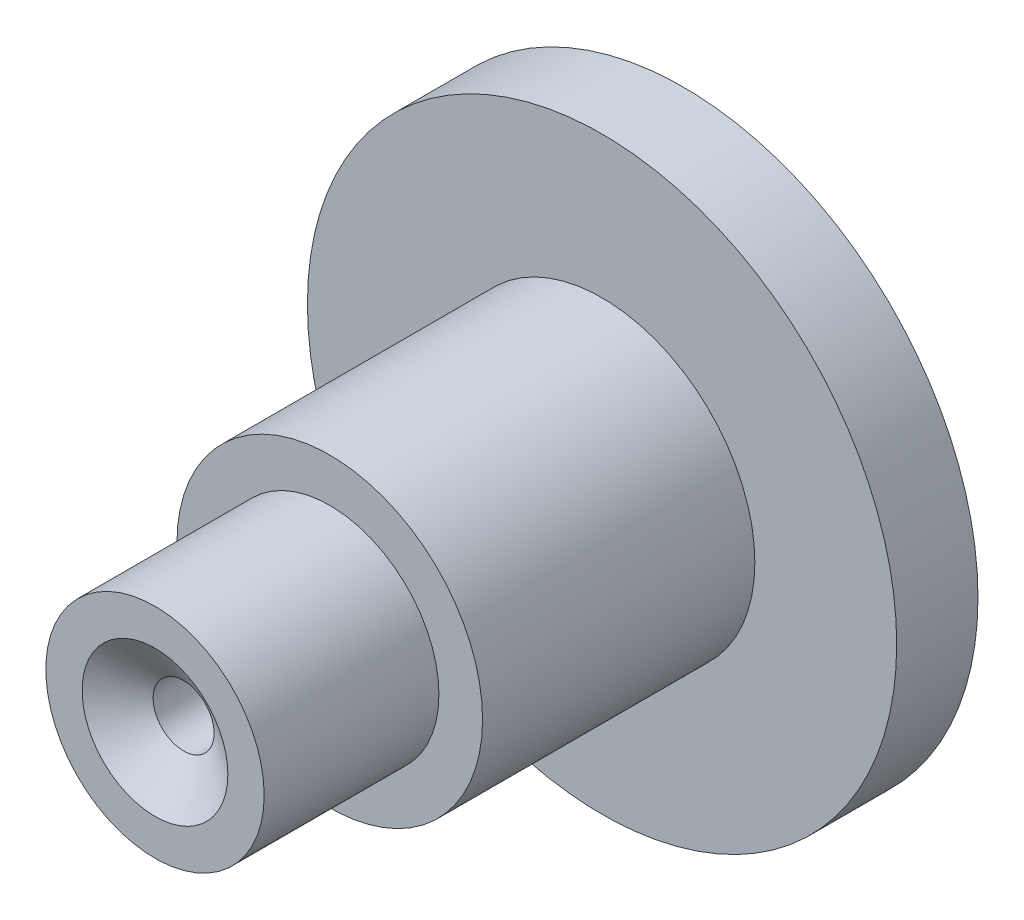
ISO-10303-21;
HEADER;
FILE_DESCRIPTION(('STEP AP214'),'2;1');
FILE_NAME('part.step','',(''),(''),'','','');
FILE_SCHEMA(('AUTOMOTIVE_DESIGN { 1 0 10303 214 1 1 1 1 }'));
ENDSEC;
DATA;
#1=APPLICATION_CONTEXT('core data for automotive mechanical design processes');
#2=APPLICATION_PROTOCOL_DEFINITION('international standard','automotive_design',2000,#1);
#3=PRODUCT_CONTEXT('',#1,'mechanical');
#4=PRODUCT('Part','Part','',(#3));
#5=PRODUCT_RELATED_PRODUCT_CATEGORY('part','',(#4));
#6=PRODUCT_DEFINITION_FORMATION('','',#4);
#7=PRODUCT_DEFINITION_CONTEXT('part definition',#1,'design');
#8=PRODUCT_DEFINITION('design','',#6,#7);
#9=PRODUCT_DEFINITION_SHAPE('','',#8);
#10=(LENGTH_UNIT() NAMED_UNIT(*) SI_UNIT(.MILLI.,.METRE.));
#11=(NAMED_UNIT(*) PLANE_ANGLE_UNIT() SI_UNIT($,.RADIAN.));
#12=(NAMED_UNIT(*) SI_UNIT($,.STERADIAN.) SOLID_ANGLE_UNIT());
#13=UNCERTAINTY_MEASURE_WITH_UNIT(LENGTH_MEASURE(1.E-05),#10,'distance_accuracy_value','');
#14=(GEOMETRIC_REPRESENTATION_CONTEXT(3) GLOBAL_UNCERTAINTY_ASSIGNED_CONTEXT((#13)) GLOBAL_UNIT_ASSIGNED_CONTEXT((#10,
#11,#12)) REPRESENTATION_CONTEXT('',''));
#15=CARTESIAN_POINT('',(0.,0.,0.));
#16=DIRECTION('',(0.,0.,1.));
#17=DIRECTION('',(1.,0.,0.));
#18=AXIS2_PLACEMENT_3D('',#15,#16,#17);
#19=CARTESIAN_POINT('',(0.,0.,0.));
#20=DIRECTION('',(0.,0.,1.));
#21=DIRECTION('',(1.,0.,0.));
#22=AXIS2_PLACEMENT_3D('',#19,#20,#21);
#23=PLANE('',#22);
#24=CARTESIAN_POINT('',(0.,0.,0.));
#25=DIRECTION('',(0.,0.,1.));
#26=DIRECTION('',(1.,0.,0.));
#27=AXIS2_PLACEMENT_3D('',#24,#25,#26);
#28=CIRCLE('',#27,46.0375);
#29=CARTESIAN_POINT('',(46.0375,0.,0.));
#30=VERTEX_POINT('',#29);
#31=EDGE_CURVE('E10',#30,#30,#28,.T.);
#32=ORIENTED_EDGE('',*,*,#31,.F.);
#33=EDGE_LOOP('',(#32));
#34=FACE_BOUND('',#33,.T.);
#35=ADVANCED_FACE('F37',(#34),#23,.F.);
#36=CARTESIAN_POINT('',(0.,0.,57.15));
#37=DIRECTION('',(0.,0.,1.));
#38=DIRECTION('',(1.,0.,0.));
#39=AXIS2_PLACEMENT_3D('',#36,#37,#38);
#40=CYLINDRICAL_SURFACE('',#39,46.0375);
#41=CARTESIAN_POINT('',(0.,0.,12.7));
#42=DIRECTION('',(0.,0.,1.));
#43=DIRECTION('',(1.,0.,0.));
#44=AXIS2_PLACEMENT_3D('',#41,#42,#43);
#45=CIRCLE('',#44,46.0375);
#46=CARTESIAN_POINT('',(46.0375,0.,12.7));
#47=VERTEX_POINT('',#46);
#48=EDGE_CURVE('E44',#47,#47,#45,.T.);
#49=ORIENTED_EDGE('',*,*,#48,.F.);
#50=EDGE_LOOP('',(#49));
#51=FACE_BOUND('',#50,.T.);
#52=ORIENTED_EDGE('',*,*,#31,.T.);
#53=EDGE_LOOP('',(#52));
#54=FACE_BOUND('',#53,.T.);
#55=ADVANCED_FACE('F121',(#51,#54),#40,.T.);
#56=CARTESIAN_POINT('',(0.,46.0375,12.7));
#57=DIRECTION('',(0.,0.,-1.));
#58=DIRECTION('',(-1.,0.,0.));
#59=AXIS2_PLACEMENT_3D('',#56,#57,#58);
#60=PLANE('',#59);
#61=CARTESIAN_POINT('',(0.,0.,12.7));
#62=DIRECTION('',(0.,0.,1.));
#63=DIRECTION('',(1.,0.,0.));
#64=AXIS2_PLACEMENT_3D('',#61,#62,#63);
#65=CIRCLE('',#64,23.876);
#66=CARTESIAN_POINT('',(23.876,0.,12.7));
#67=VERTEX_POINT('',#66);
#68=EDGE_CURVE('E49',#67,#67,#65,.T.);
#69=ORIENTED_EDGE('',*,*,#68,.F.);
#70=EDGE_LOOP('',(#69));
#71=FACE_BOUND('',#70,.T.);
#72=ORIENTED_EDGE('',*,*,#48,.T.);
#73=EDGE_LOOP('',(#72));
#74=FACE_BOUND('',#73,.T.);
#75=ADVANCED_FACE('F116',(#71,#74),#60,.F.);
#76=CARTESIAN_POINT('',(0.,0.,57.15));
#77=DIRECTION('',(0.,0.,1.));
#78=DIRECTION('',(1.,0.,0.));
#79=AXIS2_PLACEMENT_3D('',#76,#77,#78);
#80=CYLINDRICAL_SURFACE('',#79,23.876);
#81=CARTESIAN_POINT('',(0.,0.,55.245));
#82=DIRECTION('',(0.,0.,1.));
#83=DIRECTION('',(1.,0.,0.));
#84=AXIS2_PLACEMENT_3D('',#81,#82,#83);
#85=CIRCLE('',#84,23.876);
#86=CARTESIAN_POINT('',(23.876,0.,55.245));
#87=VERTEX_POINT('',#86);
#88=EDGE_CURVE('E54',#87,#87,#85,.T.);
#89=ORIENTED_EDGE('',*,*,#88,.F.);
#90=EDGE_LOOP('',(#89));
#91=FACE_BOUND('',#90,.T.);
#92=ORIENTED_EDGE('',*,*,#68,.T.);
#93=EDGE_LOOP('',(#92));
#94=FACE_BOUND('',#93,.T.);
#95=ADVANCED_FACE('F110',(#91,#94),#80,.T.);
#96=CARTESIAN_POINT('',(0.,23.876,55.245));
#97=DIRECTION('',(0.,0.,-1.));
#98=DIRECTION('',(-1.,0.,0.));
#99=AXIS2_PLACEMENT_3D('',#96,#97,#98);
#100=PLANE('',#99);
#101=CARTESIAN_POINT('',(0.,0.,55.245));
#102=DIRECTION('',(0.,0.,1.));
#103=DIRECTION('',(1.,0.,0.));
#104=AXIS2_PLACEMENT_3D('',#101,#102,#103);
#105=CIRCLE('',#104,17.0595499569898);
#106=CARTESIAN_POINT('',(17.0595499569898,0.,55.245));
#107=VERTEX_POINT('',#106);
#108=EDGE_CURVE('E60',#107,#107,#105,.T.);
#109=ORIENTED_EDGE('',*,*,#108,.F.);
#110=EDGE_LOOP('',(#109));
#111=FACE_BOUND('',#110,.T.);
#112=ORIENTED_EDGE('',*,*,#88,.T.);
#113=EDGE_LOOP('',(#112));
#114=FACE_BOUND('',#113,.T.);
#115=ADVANCED_FACE('F104',(#111,#114),#100,.F.);
#116=CARTESIAN_POINT('',(0.,0.,57.15));
#117=DIRECTION('',(0.,0.,1.));
#118=DIRECTION('',(1.,0.,0.));
#119=AXIS2_PLACEMENT_3D('',#116,#117,#118);
#120=CYLINDRICAL_SURFACE('',#119,17.0595499569898);
#121=CARTESIAN_POINT('',(0.,0.,82.55));
#122=DIRECTION('',(0.,0.,1.));
#123=DIRECTION('',(1.,0.,0.));
#124=AXIS2_PLACEMENT_3D('',#121,#122,#123);
#125=CIRCLE('',#124,17.0595499569898);
#126=CARTESIAN_POINT('',(17.0595499569898,0.,82.55));
#127=VERTEX_POINT('',#126);
#128=EDGE_CURVE('E64',#127,#127,#125,.T.);
#129=ORIENTED_EDGE('',*,*,#128,.F.);
#130=EDGE_LOOP('',(#129));
#131=FACE_BOUND('',#130,.T.);
#132=ORIENTED_EDGE('',*,*,#108,.T.);
#133=EDGE_LOOP('',(#132));
#134=FACE_BOUND('',#133,.T.);
#135=ADVANCED_FACE('F98',(#131,#134),#120,.T.);
#136=CARTESIAN_POINT('',(0.,17.0595499569898,82.55));
#137=DIRECTION('',(0.,0.,-1.));
#138=DIRECTION('',(-1.,0.,0.));
#139=AXIS2_PLACEMENT_3D('',#136,#137,#138);
#140=PLANE('',#139);
#141=CARTESIAN_POINT('',(0.,0.,82.55));
#142=DIRECTION('',(0.,0.,1.));
#143=DIRECTION('',(1.,0.,0.));
#144=AXIS2_PLACEMENT_3D('',#141,#142,#143);
#145=CIRCLE('',#144,11.385820752823);
#146=CARTESIAN_POINT('',(11.385820752823,0.,82.55));
#147=VERTEX_POINT('',#146);
#148=EDGE_CURVE('E68',#147,#147,#145,.T.);
#149=ORIENTED_EDGE('',*,*,#148,.F.);
#150=EDGE_LOOP('',(#149));
#151=FACE_BOUND('',#150,.T.);
#152=ORIENTED_EDGE('',*,*,#128,.T.);
#153=EDGE_LOOP('',(#152));
#154=FACE_BOUND('',#153,.T.);
#155=ADVANCED_FACE('F92',(#151,#154),#140,.F.);
#156=CARTESIAN_POINT('',(0.,0.,82.55));
#157=DIRECTION('',(0.,0.,1.));
#158=DIRECTION('',(1.,0.,0.));
#159=AXIS2_PLACEMENT_3D('',#156,#157,#158);
#160=CONICAL_SURFACE('',#159,11.385820752823,0.976880170026561);
#161=CARTESIAN_POINT('',(0.,0.,78.0776531689114));
#162=DIRECTION('',(0.,0.,1.));
#163=DIRECTION('',(1.,0.,0.));
#164=AXIS2_PLACEMENT_3D('',#161,#162,#163);
#165=CIRCLE('',#164,4.7625);
#166=CARTESIAN_POINT('',(4.7625,0.,78.0776531689114));
#167=VERTEX_POINT('',#166);
#168=EDGE_CURVE('E72',#167,#167,#165,.T.);
#169=ORIENTED_EDGE('',*,*,#168,.F.);
#170=EDGE_LOOP('',(#169));
#171=FACE_BOUND('',#170,.T.);
#172=ORIENTED_EDGE('',*,*,#148,.T.);
#173=EDGE_LOOP('',(#172));
#174=FACE_BOUND('',#173,.T.);
#175=ADVANCED_FACE('F86',(#171,#174),#160,.F.);
#176=CARTESIAN_POINT('',(0.,0.,57.15));
#177=DIRECTION('',(0.,0.,1.));
#178=DIRECTION('',(1.,0.,0.));
#179=AXIS2_PLACEMENT_3D('',#176,#177,#178);
#180=CYLINDRICAL_SURFACE('',#179,4.7625);
#181=CARTESIAN_POINT('',(0.,0.,57.15));
#182=DIRECTION('',(0.,0.,1.));
#183=DIRECTION('',(1.,0.,0.));
#184=AXIS2_PLACEMENT_3D('',#181,#182,#183);
#185=CIRCLE('',#184,4.7625);
#186=CARTESIAN_POINT('',(4.7625,0.,57.15));
#187=VERTEX_POINT('',#186);
#188=EDGE_CURVE('E76',#187,#187,#185,.T.);
#189=ORIENTED_EDGE('',*,*,#188,.F.);
#190=EDGE_LOOP('',(#189));
#191=FACE_BOUND('',#190,.T.);
#192=ORIENTED_EDGE('',*,*,#168,.T.);
#193=EDGE_LOOP('',(#192));
#194=FACE_BOUND('',#193,.T.);
#195=ADVANCED_FACE('F83',(#191,#194),#180,.F.);
#196=CARTESIAN_POINT('',(0.,4.7625,57.15));
#197=DIRECTION('',(0.,0.,-1.));
#198=DIRECTION('',(-1.,0.,0.));
#199=AXIS2_PLACEMENT_3D('',#196,#197,#198);
#200=PLANE('',#199);
#201=ORIENTED_EDGE('',*,*,#188,.T.);
#202=EDGE_LOOP('',(#201));
#203=FACE_BOUND('',#202,.T.);
#204=ADVANCED_FACE('F81',(#203),#200,.F.);
#205=CLOSED_SHELL('',(#35,#55,#75,#95,#115,#135,#155,#175,#195,#204));
#206=MANIFOLD_SOLID_BREP('B2',#205);
#207=ADVANCED_BREP_SHAPE_REPRESENTATION('',(#18,#206),#14);
#208=SHAPE_DEFINITION_REPRESENTATION(#9,#207);
ENDSEC;
END-ISO-10303-21;
